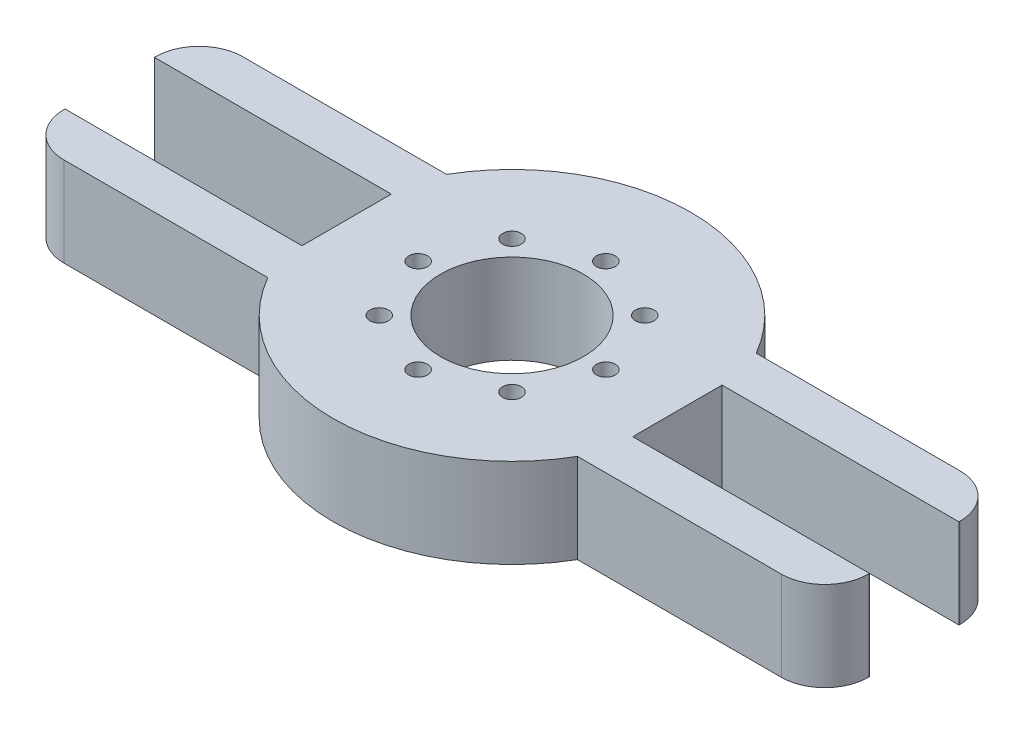
ISO-10303-21;
HEADER;
FILE_DESCRIPTION(('STEP AP214'),'2;1');
FILE_NAME('part.step','',(''),(''),'','','');
FILE_SCHEMA(('AUTOMOTIVE_DESIGN { 1 0 10303 214 1 1 1 1 }'));
ENDSEC;
DATA;
#1=APPLICATION_CONTEXT('core data for automotive mechanical design processes');
#2=APPLICATION_PROTOCOL_DEFINITION('international standard','automotive_design',2000,#1);
#3=PRODUCT_CONTEXT('',#1,'mechanical');
#4=PRODUCT('Part','Part','',(#3));
#5=PRODUCT_RELATED_PRODUCT_CATEGORY('part','',(#4));
#6=PRODUCT_DEFINITION_FORMATION('','',#4);
#7=PRODUCT_DEFINITION_CONTEXT('part definition',#1,'design');
#8=PRODUCT_DEFINITION('design','',#6,#7);
#9=PRODUCT_DEFINITION_SHAPE('','',#8);
#10=(LENGTH_UNIT() NAMED_UNIT(*) SI_UNIT(.MILLI.,.METRE.));
#11=(NAMED_UNIT(*) PLANE_ANGLE_UNIT() SI_UNIT($,.RADIAN.));
#12=(NAMED_UNIT(*) SI_UNIT($,.STERADIAN.) SOLID_ANGLE_UNIT());
#13=UNCERTAINTY_MEASURE_WITH_UNIT(LENGTH_MEASURE(1.E-05),#10,'distance_accuracy_value','');
#14=(GEOMETRIC_REPRESENTATION_CONTEXT(3) GLOBAL_UNCERTAINTY_ASSIGNED_CONTEXT((#13)) GLOBAL_UNIT_ASSIGNED_CONTEXT((#10,
#11,#12)) REPRESENTATION_CONTEXT('',''));
#15=CARTESIAN_POINT('',(0.,0.,0.));
#16=DIRECTION('',(0.,0.,1.));
#17=DIRECTION('',(1.,0.,0.));
#18=AXIS2_PLACEMENT_3D('',#15,#16,#17);
#19=CARTESIAN_POINT('',(-90.,20.,-20.));
#20=DIRECTION('',(-1.,0.,0.));
#21=DIRECTION('',(0.,0.,1.));
#22=AXIS2_PLACEMENT_3D('',#19,#20,#21);
#23=PLANE('',#22);
#24=DIRECTION('',(0.,0.,-1.));
#25=VECTOR('',#24,1.);
#26=CARTESIAN_POINT('',(-90.,20.,-20.));
#27=LINE('',#26,#25);
#28=CARTESIAN_POINT('',(-90.,20.,-10.));
#29=VERTEX_POINT('',#28);
#30=CARTESIAN_POINT('',(-90.,20.,-10.25));
#31=VERTEX_POINT('',#30);
#32=EDGE_CURVE('E209',#29,#31,#27,.T.);
#33=ORIENTED_EDGE('',*,*,#32,.T.);
#34=DIRECTION('',(0.,-1.,0.));
#35=VECTOR('',#34,1.);
#36=CARTESIAN_POINT('',(-90.,20.,-10.25));
#37=LINE('',#36,#35);
#38=CARTESIAN_POINT('',(-90.,0.,-10.25));
#39=VERTEX_POINT('',#38);
#40=EDGE_CURVE('E54',#31,#39,#37,.T.);
#41=ORIENTED_EDGE('',*,*,#40,.T.);
#42=DIRECTION('',(0.,0.,-1.));
#43=VECTOR('',#42,1.);
#44=CARTESIAN_POINT('',(-90.,0.,-20.));
#45=LINE('',#44,#43);
#46=CARTESIAN_POINT('',(-90.,0.,-10.));
#47=VERTEX_POINT('',#46);
#48=EDGE_CURVE('E242',#47,#39,#45,.T.);
#49=ORIENTED_EDGE('',*,*,#48,.F.);
#50=DIRECTION('',(0.,1.,0.));
#51=VECTOR('',#50,1.);
#52=CARTESIAN_POINT('',(-90.,-56.6480361530742,-10.));
#53=LINE('',#52,#51);
#54=EDGE_CURVE('E193',#47,#29,#53,.T.);
#55=ORIENTED_EDGE('',*,*,#54,.T.);
#56=EDGE_LOOP('',(#33,#41,#49,#55));
#57=FACE_BOUND('',#56,.T.);
#58=ADVANCED_FACE('F45',(#57),#23,.T.);
#59=CARTESIAN_POINT('',(-90.,0.,10.25));
#60=VERTEX_POINT('',#59);
#61=CARTESIAN_POINT('',(-90.,0.,10.));
#62=VERTEX_POINT('',#61);
#63=EDGE_CURVE('E244',#60,#62,#45,.T.);
#64=ORIENTED_EDGE('',*,*,#63,.F.);
#65=DIRECTION('',(0.,-1.,0.));
#66=VECTOR('',#65,1.);
#67=CARTESIAN_POINT('',(-90.,20.,10.25));
#68=LINE('',#67,#66);
#69=CARTESIAN_POINT('',(-90.,20.,10.25));
#70=VERTEX_POINT('',#69);
#71=EDGE_CURVE('E379',#60,#70,#68,.F.);
#72=ORIENTED_EDGE('',*,*,#71,.T.);
#73=CARTESIAN_POINT('',(-90.,20.,10.));
#74=VERTEX_POINT('',#73);
#75=EDGE_CURVE('E231',#70,#74,#27,.T.);
#76=ORIENTED_EDGE('',*,*,#75,.T.);
#77=DIRECTION('',(0.,1.,0.));
#78=VECTOR('',#77,1.);
#79=CARTESIAN_POINT('',(-90.,-56.6480361530742,10.));
#80=LINE('',#79,#78);
#81=EDGE_CURVE('E218',#62,#74,#80,.T.);
#82=ORIENTED_EDGE('',*,*,#81,.F.);
#83=EDGE_LOOP('',(#64,#72,#76,#82));
#84=FACE_BOUND('',#83,.T.);
#85=ADVANCED_FACE('F503',(#84),#23,.T.);
#86=CARTESIAN_POINT('',(90.,20.,-20.));
#87=DIRECTION('',(-1.,0.,0.));
#88=DIRECTION('',(0.,0.,1.));
#89=AXIS2_PLACEMENT_3D('',#86,#87,#88);
#90=PLANE('',#89);
#91=DIRECTION('',(0.,0.,-1.));
#92=VECTOR('',#91,1.);
#93=CARTESIAN_POINT('',(90.,0.,-20.));
#94=LINE('',#93,#92);
#95=CARTESIAN_POINT('',(90.,0.,-10.));
#96=VERTEX_POINT('',#95);
#97=CARTESIAN_POINT('',(90.,0.,-10.25));
#98=VERTEX_POINT('',#97);
#99=EDGE_CURVE('E330',#96,#98,#94,.T.);
#100=ORIENTED_EDGE('',*,*,#99,.T.);
#101=DIRECTION('',(0.,-1.,0.));
#102=VECTOR('',#101,1.);
#103=CARTESIAN_POINT('',(90.,20.,-10.25));
#104=LINE('',#103,#102);
#105=CARTESIAN_POINT('',(90.,20.,-10.25));
#106=VERTEX_POINT('',#105);
#107=EDGE_CURVE('E366',#98,#106,#104,.F.);
#108=ORIENTED_EDGE('',*,*,#107,.T.);
#109=DIRECTION('',(0.,0.,-1.));
#110=VECTOR('',#109,1.);
#111=CARTESIAN_POINT('',(90.,20.,-20.));
#112=LINE('',#111,#110);
#113=CARTESIAN_POINT('',(90.,20.,-10.));
#114=VERTEX_POINT('',#113);
#115=EDGE_CURVE('E312',#114,#106,#112,.T.);
#116=ORIENTED_EDGE('',*,*,#115,.F.);
#117=DIRECTION('',(0.,1.,0.));
#118=VECTOR('',#117,1.);
#119=CARTESIAN_POINT('',(90.,-56.6480361530742,-10.));
#120=LINE('',#119,#118);
#121=EDGE_CURVE('E282',#96,#114,#120,.T.);
#122=ORIENTED_EDGE('',*,*,#121,.F.);
#123=EDGE_LOOP('',(#100,#108,#116,#122));
#124=FACE_BOUND('',#123,.T.);
#125=ADVANCED_FACE('F509',(#124),#90,.F.);
#126=CARTESIAN_POINT('',(0.,20.,0.));
#127=DIRECTION('',(0.,-1.,0.));
#128=DIRECTION('',(0.,0.,-1.));
#129=AXIS2_PLACEMENT_3D('',#126,#127,#128);
#130=CYLINDRICAL_SURFACE('',#129,40.);
#131=CARTESIAN_POINT('',(0.,0.,0.));
#132=DIRECTION('',(0.,1.,0.));
#133=DIRECTION('',(0.,0.,1.));
#134=AXIS2_PLACEMENT_3D('',#131,#132,#133);
#135=CIRCLE('',#134,40.);
#136=CARTESIAN_POINT('',(34.6410161513776,0.,-20.));
#137=VERTEX_POINT('',#136);
#138=CARTESIAN_POINT('',(-34.6410161513776,0.,-20.));
#139=VERTEX_POINT('',#138);
#140=EDGE_CURVE('E293',#137,#139,#135,.T.);
#141=ORIENTED_EDGE('',*,*,#140,.T.);
#142=DIRECTION('',(0.,-1.,0.));
#143=VECTOR('',#142,1.);
#144=CARTESIAN_POINT('',(-34.6410161513776,20.,-20.));
#145=LINE('',#144,#143);
#146=CARTESIAN_POINT('',(-34.6410161513776,20.,-20.));
#147=VERTEX_POINT('',#146);
#148=EDGE_CURVE('E253',#147,#139,#145,.T.);
#149=ORIENTED_EDGE('',*,*,#148,.F.);
#150=CARTESIAN_POINT('',(0.,20.,0.));
#151=DIRECTION('',(0.,1.,0.));
#152=DIRECTION('',(0.,0.,1.));
#153=AXIS2_PLACEMENT_3D('',#150,#151,#152);
#154=CIRCLE('',#153,40.);
#155=CARTESIAN_POINT('',(34.6410161513776,20.,-20.));
#156=VERTEX_POINT('',#155);
#157=EDGE_CURVE('E300',#156,#147,#154,.T.);
#158=ORIENTED_EDGE('',*,*,#157,.F.);
#159=DIRECTION('',(0.,-1.,0.));
#160=VECTOR('',#159,1.);
#161=CARTESIAN_POINT('',(34.6410161513776,20.,-20.));
#162=LINE('',#161,#160);
#163=EDGE_CURVE('E319',#156,#137,#162,.T.);
#164=ORIENTED_EDGE('',*,*,#163,.T.);
#165=EDGE_LOOP('',(#141,#149,#158,#164));
#166=FACE_BOUND('',#165,.T.);
#167=ADVANCED_FACE('F552',(#166),#130,.T.);
#168=CARTESIAN_POINT('',(0.,20.,0.));
#169=DIRECTION('',(0.,-1.,0.));
#170=DIRECTION('',(0.,0.,-1.));
#171=AXIS2_PLACEMENT_3D('',#168,#169,#170);
#172=CYLINDRICAL_SURFACE('',#171,40.);
#173=CARTESIAN_POINT('',(0.,0.,0.));
#174=DIRECTION('',(0.,1.,0.));
#175=DIRECTION('',(0.,0.,1.));
#176=AXIS2_PLACEMENT_3D('',#173,#174,#175);
#177=CIRCLE('',#176,40.);
#178=CARTESIAN_POINT('',(-34.6410161513775,0.,20.));
#179=VERTEX_POINT('',#178);
#180=CARTESIAN_POINT('',(34.6410161513775,0.,20.));
#181=VERTEX_POINT('',#180);
#182=EDGE_CURVE('E323',#179,#181,#177,.T.);
#183=ORIENTED_EDGE('',*,*,#182,.T.);
#184=DIRECTION('',(0.,-1.,0.));
#185=VECTOR('',#184,1.);
#186=CARTESIAN_POINT('',(34.6410161513775,20.,20.));
#187=LINE('',#186,#185);
#188=CARTESIAN_POINT('',(34.6410161513775,20.,20.));
#189=VERTEX_POINT('',#188);
#190=EDGE_CURVE('E339',#189,#181,#187,.T.);
#191=ORIENTED_EDGE('',*,*,#190,.F.);
#192=CARTESIAN_POINT('',(0.,20.,0.));
#193=DIRECTION('',(0.,1.,0.));
#194=DIRECTION('',(0.,0.,1.));
#195=AXIS2_PLACEMENT_3D('',#192,#193,#194);
#196=CIRCLE('',#195,40.);
#197=CARTESIAN_POINT('',(-34.6410161513775,20.,20.));
#198=VERTEX_POINT('',#197);
#199=EDGE_CURVE('E304',#198,#189,#196,.T.);
#200=ORIENTED_EDGE('',*,*,#199,.F.);
#201=DIRECTION('',(0.,-1.,0.));
#202=VECTOR('',#201,1.);
#203=CARTESIAN_POINT('',(-34.6410161513775,20.,20.));
#204=LINE('',#203,#202);
#205=EDGE_CURVE('E238',#198,#179,#204,.T.);
#206=ORIENTED_EDGE('',*,*,#205,.T.);
#207=EDGE_LOOP('',(#183,#191,#200,#206));
#208=FACE_BOUND('',#207,.T.);
#209=ADVANCED_FACE('F548',(#208),#172,.T.);
#210=CARTESIAN_POINT('',(90.,20.,20.));
#211=DIRECTION('',(0.,0.,-1.));
#212=DIRECTION('',(-1.,0.,0.));
#213=AXIS2_PLACEMENT_3D('',#210,#211,#212);
#214=PLANE('',#213);
#215=DIRECTION('',(1.,0.,0.));
#216=VECTOR('',#215,1.);
#217=CARTESIAN_POINT('',(90.,0.,20.));
#218=LINE('',#217,#216);
#219=CARTESIAN_POINT('',(80.25,0.,20.));
#220=VERTEX_POINT('',#219);
#221=EDGE_CURVE('E326',#181,#220,#218,.T.);
#222=ORIENTED_EDGE('',*,*,#221,.T.);
#223=DIRECTION('',(0.,-1.,0.));
#224=VECTOR('',#223,1.);
#225=CARTESIAN_POINT('',(80.25,20.,20.));
#226=LINE('',#225,#224);
#227=CARTESIAN_POINT('',(80.25,20.,20.));
#228=VERTEX_POINT('',#227);
#229=EDGE_CURVE('E353',#220,#228,#226,.F.);
#230=ORIENTED_EDGE('',*,*,#229,.T.);
#231=DIRECTION('',(1.,0.,0.));
#232=VECTOR('',#231,1.);
#233=CARTESIAN_POINT('',(90.,20.,20.));
#234=LINE('',#233,#232);
#235=EDGE_CURVE('E308',#189,#228,#234,.T.);
#236=ORIENTED_EDGE('',*,*,#235,.F.);
#237=ORIENTED_EDGE('',*,*,#190,.T.);
#238=EDGE_LOOP('',(#222,#230,#236,#237));
#239=FACE_BOUND('',#238,.T.);
#240=ADVANCED_FACE('F544',(#239),#214,.F.);
#241=CARTESIAN_POINT('',(90.,20.,10.25));
#242=VERTEX_POINT('',#241);
#243=CARTESIAN_POINT('',(90.,20.,10.));
#244=VERTEX_POINT('',#243);
#245=EDGE_CURVE('E313',#242,#244,#112,.T.);
#246=ORIENTED_EDGE('',*,*,#245,.F.);
#247=DIRECTION('',(0.,-1.,0.));
#248=VECTOR('',#247,1.);
#249=CARTESIAN_POINT('',(90.,20.,10.25));
#250=LINE('',#249,#248);
#251=CARTESIAN_POINT('',(90.,0.,10.25));
#252=VERTEX_POINT('',#251);
#253=EDGE_CURVE('E343',#242,#252,#250,.T.);
#254=ORIENTED_EDGE('',*,*,#253,.T.);
#255=CARTESIAN_POINT('',(90.,0.,10.));
#256=VERTEX_POINT('',#255);
#257=EDGE_CURVE('E331',#252,#256,#94,.T.);
#258=ORIENTED_EDGE('',*,*,#257,.T.);
#259=DIRECTION('',(0.,1.,0.));
#260=VECTOR('',#259,1.);
#261=CARTESIAN_POINT('',(90.,-56.6480361530742,10.));
#262=LINE('',#261,#260);
#263=EDGE_CURVE('E285',#256,#244,#262,.T.);
#264=ORIENTED_EDGE('',*,*,#263,.T.);
#265=EDGE_LOOP('',(#246,#254,#258,#264));
#266=FACE_BOUND('',#265,.T.);
#267=ADVANCED_FACE('F540',(#266),#90,.F.);
#268=CARTESIAN_POINT('',(34.6410161513776,20.,-20.));
#269=DIRECTION('',(0.,0.,1.));
#270=DIRECTION('',(1.,0.,0.));
#271=AXIS2_PLACEMENT_3D('',#268,#269,#270);
#272=PLANE('',#271);
#273=DIRECTION('',(-1.,0.,0.));
#274=VECTOR('',#273,1.);
#275=CARTESIAN_POINT('',(34.6410161513776,20.,-20.));
#276=LINE('',#275,#274);
#277=CARTESIAN_POINT('',(80.25,20.,-20.));
#278=VERTEX_POINT('',#277);
#279=EDGE_CURVE('E316',#278,#156,#276,.T.);
#280=ORIENTED_EDGE('',*,*,#279,.F.);
#281=DIRECTION('',(0.,-1.,0.));
#282=VECTOR('',#281,1.);
#283=CARTESIAN_POINT('',(80.25,20.,-20.));
#284=LINE('',#283,#282);
#285=CARTESIAN_POINT('',(80.25,0.,-20.));
#286=VERTEX_POINT('',#285);
#287=EDGE_CURVE('E362',#278,#286,#284,.T.);
#288=ORIENTED_EDGE('',*,*,#287,.T.);
#289=DIRECTION('',(-1.,0.,0.));
#290=VECTOR('',#289,1.);
#291=CARTESIAN_POINT('',(34.6410161513776,0.,-20.));
#292=LINE('',#291,#290);
#293=EDGE_CURVE('E305',#286,#137,#292,.T.);
#294=ORIENTED_EDGE('',*,*,#293,.T.);
#295=ORIENTED_EDGE('',*,*,#163,.F.);
#296=EDGE_LOOP('',(#280,#288,#294,#295));
#297=FACE_BOUND('',#296,.T.);
#298=ADVANCED_FACE('F471',(#297),#272,.F.);
#299=CARTESIAN_POINT('',(0.,20.,0.));
#300=DIRECTION('',(0.,1.,0.));
#301=DIRECTION('',(0.,0.,1.));
#302=AXIS2_PLACEMENT_3D('',#299,#300,#301);
#303=PLANE('',#302);
#304=CARTESIAN_POINT('',(21.,20.,0.));
#305=DIRECTION('',(0.,1.,0.));
#306=DIRECTION('',(0.,0.,1.));
#307=AXIS2_PLACEMENT_3D('',#304,#305,#306);
#308=CIRCLE('',#307,2.1);
#309=CARTESIAN_POINT('',(21.,20.,2.1));
#310=VERTEX_POINT('',#309);
#311=EDGE_CURVE('E456',#310,#310,#308,.T.);
#312=ORIENTED_EDGE('',*,*,#311,.F.);
#313=EDGE_LOOP('',(#312));
#314=FACE_BOUND('',#313,.T.);
#315=CARTESIAN_POINT('',(14.8492424049175,20.,14.8492424049175));
#316=DIRECTION('',(0.,1.,0.));
#317=DIRECTION('',(0.,0.,1.));
#318=AXIS2_PLACEMENT_3D('',#315,#316,#317);
#319=CIRCLE('',#318,2.1);
#320=CARTESIAN_POINT('',(14.8492424049175,20.,16.9492424049175));
#321=VERTEX_POINT('',#320);
#322=EDGE_CURVE('E452',#321,#321,#319,.T.);
#323=ORIENTED_EDGE('',*,*,#322,.F.);
#324=EDGE_LOOP('',(#323));
#325=FACE_BOUND('',#324,.T.);
#326=CARTESIAN_POINT('',(0.,20.,21.));
#327=DIRECTION('',(0.,1.,0.));
#328=DIRECTION('',(0.,0.,1.));
#329=AXIS2_PLACEMENT_3D('',#326,#327,#328);
#330=CIRCLE('',#329,2.1);
#331=CARTESIAN_POINT('',(0.,20.,23.1));
#332=VERTEX_POINT('',#331);
#333=EDGE_CURVE('E444',#332,#332,#330,.T.);
#334=ORIENTED_EDGE('',*,*,#333,.F.);
#335=EDGE_LOOP('',(#334));
#336=FACE_BOUND('',#335,.T.);
#337=CARTESIAN_POINT('',(-14.8492424049176,20.,14.8492424049174));
#338=DIRECTION('',(0.,1.,0.));
#339=DIRECTION('',(0.,0.,1.));
#340=AXIS2_PLACEMENT_3D('',#337,#338,#339);
#341=CIRCLE('',#340,2.1);
#342=CARTESIAN_POINT('',(-14.8492424049176,20.,16.9492424049174));
#343=VERTEX_POINT('',#342);
#344=EDGE_CURVE('E436',#343,#343,#341,.T.);
#345=ORIENTED_EDGE('',*,*,#344,.F.);
#346=EDGE_LOOP('',(#345));
#347=FACE_BOUND('',#346,.T.);
#348=CARTESIAN_POINT('',(-21.,20.,-1.46642216231412E-13));
#349=DIRECTION('',(0.,1.,0.));
#350=DIRECTION('',(0.,0.,1.));
#351=AXIS2_PLACEMENT_3D('',#348,#349,#350);
#352=CIRCLE('',#351,2.1);
#353=CARTESIAN_POINT('',(-21.,20.,2.09999999999985));
#354=VERTEX_POINT('',#353);
#355=EDGE_CURVE('E428',#354,#354,#352,.T.);
#356=ORIENTED_EDGE('',*,*,#355,.F.);
#357=EDGE_LOOP('',(#356));
#358=FACE_BOUND('',#357,.T.);
#359=CARTESIAN_POINT('',(-14.8492424049174,20.,-14.8492424049176));
#360=DIRECTION('',(0.,1.,0.));
#361=DIRECTION('',(0.,0.,1.));
#362=AXIS2_PLACEMENT_3D('',#359,#360,#361);
#363=CIRCLE('',#362,2.1);
#364=CARTESIAN_POINT('',(-14.8492424049174,20.,-12.7492424049176));
#365=VERTEX_POINT('',#364);
#366=EDGE_CURVE('E420',#365,#365,#363,.T.);
#367=ORIENTED_EDGE('',*,*,#366,.F.);
#368=EDGE_LOOP('',(#367));
#369=FACE_BOUND('',#368,.T.);
#370=CARTESIAN_POINT('',(2.19963324347117E-13,20.,-21.));
#371=DIRECTION('',(0.,1.,0.));
#372=DIRECTION('',(0.,0.,1.));
#373=AXIS2_PLACEMENT_3D('',#370,#371,#372);
#374=CIRCLE('',#373,2.1);
#375=CARTESIAN_POINT('',(2.19963324347117E-13,20.,-18.9));
#376=VERTEX_POINT('',#375);
#377=EDGE_CURVE('E412',#376,#376,#374,.T.);
#378=ORIENTED_EDGE('',*,*,#377,.F.);
#379=EDGE_LOOP('',(#378));
#380=FACE_BOUND('',#379,.T.);
#381=CARTESIAN_POINT('',(14.8492424049177,20.,-14.8492424049173));
#382=DIRECTION('',(0.,1.,0.));
#383=DIRECTION('',(0.,0.,1.));
#384=AXIS2_PLACEMENT_3D('',#381,#382,#383);
#385=CIRCLE('',#384,2.1);
#386=CARTESIAN_POINT('',(14.8492424049177,20.,-12.7492424049173));
#387=VERTEX_POINT('',#386);
#388=EDGE_CURVE('E403',#387,#387,#385,.T.);
#389=ORIENTED_EDGE('',*,*,#388,.F.);
#390=EDGE_LOOP('',(#389));
#391=FACE_BOUND('',#390,.T.);
#392=ORIENTED_EDGE('',*,*,#75,.F.);
#393=CARTESIAN_POINT('',(-80.25,20.,10.25));
#394=DIRECTION('',(0.,1.,0.));
#395=DIRECTION('',(0.,0.,1.));
#396=AXIS2_PLACEMENT_3D('',#393,#394,#395);
#397=CIRCLE('',#396,9.75);
#398=CARTESIAN_POINT('',(-80.25,20.,20.));
#399=VERTEX_POINT('',#398);
#400=EDGE_CURVE('E384',#70,#399,#397,.T.);
#401=ORIENTED_EDGE('',*,*,#400,.T.);
#402=DIRECTION('',(-1.,0.,0.));
#403=VECTOR('',#402,1.);
#404=CARTESIAN_POINT('',(-90.,20.,20.));
#405=LINE('',#404,#403);
#406=EDGE_CURVE('E234',#198,#399,#405,.T.);
#407=ORIENTED_EDGE('',*,*,#406,.F.);
#408=ORIENTED_EDGE('',*,*,#199,.T.);
#409=ORIENTED_EDGE('',*,*,#235,.T.);
#410=CARTESIAN_POINT('',(80.25,20.,10.25));
#411=DIRECTION('',(0.,1.,0.));
#412=DIRECTION('',(0.,0.,1.));
#413=AXIS2_PLACEMENT_3D('',#410,#411,#412);
#414=CIRCLE('',#413,9.75);
#415=EDGE_CURVE('E359',#228,#242,#414,.T.);
#416=ORIENTED_EDGE('',*,*,#415,.T.);
#417=ORIENTED_EDGE('',*,*,#245,.T.);
#418=DIRECTION('',(1.,0.,0.));
#419=VECTOR('',#418,1.);
#420=CARTESIAN_POINT('',(90.,20.,10.));
#421=LINE('',#420,#419);
#422=CARTESIAN_POINT('',(37.,20.,10.));
#423=VERTEX_POINT('',#422);
#424=EDGE_CURVE('E270',#423,#244,#421,.T.);
#425=ORIENTED_EDGE('',*,*,#424,.F.);
#426=DIRECTION('',(0.,0.,1.));
#427=VECTOR('',#426,1.);
#428=CARTESIAN_POINT('',(37.,20.,10.));
#429=LINE('',#428,#427);
#430=CARTESIAN_POINT('',(37.,20.,-10.));
#431=VERTEX_POINT('',#430);
#432=EDGE_CURVE('E266',#431,#423,#429,.T.);
#433=ORIENTED_EDGE('',*,*,#432,.F.);
#434=DIRECTION('',(-1.,0.,0.));
#435=VECTOR('',#434,1.);
#436=CARTESIAN_POINT('',(37.,20.,-10.));
#437=LINE('',#436,#435);
#438=EDGE_CURVE('E275',#114,#431,#437,.T.);
#439=ORIENTED_EDGE('',*,*,#438,.F.);
#440=ORIENTED_EDGE('',*,*,#115,.T.);
#441=CARTESIAN_POINT('',(80.25,20.,-10.25));
#442=DIRECTION('',(0.,1.,0.));
#443=DIRECTION('',(0.,0.,1.));
#444=AXIS2_PLACEMENT_3D('',#441,#442,#443);
#445=CIRCLE('',#444,9.75);
#446=EDGE_CURVE('E356',#106,#278,#445,.T.);
#447=ORIENTED_EDGE('',*,*,#446,.T.);
#448=ORIENTED_EDGE('',*,*,#279,.T.);
#449=ORIENTED_EDGE('',*,*,#157,.T.);
#450=DIRECTION('',(1.,0.,0.));
#451=VECTOR('',#450,1.);
#452=CARTESIAN_POINT('',(-34.6410161513776,20.,-20.));
#453=LINE('',#452,#451);
#454=CARTESIAN_POINT('',(-80.25,20.,-20.));
#455=VERTEX_POINT('',#454);
#456=EDGE_CURVE('E227',#455,#147,#453,.T.);
#457=ORIENTED_EDGE('',*,*,#456,.F.);
#458=CARTESIAN_POINT('',(-80.25,20.,-10.25));
#459=DIRECTION('',(0.,1.,0.));
#460=DIRECTION('',(0.,0.,1.));
#461=AXIS2_PLACEMENT_3D('',#458,#459,#460);
#462=CIRCLE('',#461,9.75);
#463=EDGE_CURVE('E66',#455,#31,#462,.T.);
#464=ORIENTED_EDGE('',*,*,#463,.T.);
#465=ORIENTED_EDGE('',*,*,#32,.F.);
#466=DIRECTION('',(1.,0.,0.));
#467=VECTOR('',#466,1.);
#468=CARTESIAN_POINT('',(-37.,20.,-10.));
#469=LINE('',#468,#467);
#470=CARTESIAN_POINT('',(-37.,20.,-10.));
#471=VERTEX_POINT('',#470);
#472=EDGE_CURVE('E186',#29,#471,#469,.T.);
#473=ORIENTED_EDGE('',*,*,#472,.T.);
#474=DIRECTION('',(0.,0.,1.));
#475=VECTOR('',#474,1.);
#476=CARTESIAN_POINT('',(-37.,20.,10.));
#477=LINE('',#476,#475);
#478=CARTESIAN_POINT('',(-37.,20.,10.));
#479=VERTEX_POINT('',#478);
#480=EDGE_CURVE('E197',#471,#479,#477,.T.);
#481=ORIENTED_EDGE('',*,*,#480,.T.);
#482=DIRECTION('',(-1.,0.,0.));
#483=VECTOR('',#482,1.);
#484=CARTESIAN_POINT('',(-90.,20.,10.));
#485=LINE('',#484,#483);
#486=EDGE_CURVE('E194',#479,#74,#485,.T.);
#487=ORIENTED_EDGE('',*,*,#486,.T.);
#488=EDGE_LOOP('',(#392,#401,#407,#408,#409,#416,#417,#425,#433,#439,#440,#447,#448,#449,#457,
#464,#465,#473,#481,#487));
#489=FACE_BOUND('',#488,.T.);
#490=CARTESIAN_POINT('',(0.,20.,0.));
#491=DIRECTION('',(0.,1.,0.));
#492=DIRECTION('',(0.,0.,1.));
#493=AXIS2_PLACEMENT_3D('',#490,#491,#492);
#494=CIRCLE('',#493,16.);
#495=CARTESIAN_POINT('',(0.,20.,16.));
#496=VERTEX_POINT('',#495);
#497=EDGE_CURVE('E271',#496,#496,#494,.T.);
#498=ORIENTED_EDGE('',*,*,#497,.F.);
#499=EDGE_LOOP('',(#498));
#500=FACE_BOUND('',#499,.T.);
#501=ADVANCED_FACE('F207',(#314,#325,#336,#347,#358,#369,#380,#391,#489,#500),#303,.T.);
#502=CARTESIAN_POINT('',(0.,0.,0.));
#503=DIRECTION('',(0.,1.,0.));
#504=DIRECTION('',(0.,0.,1.));
#505=AXIS2_PLACEMENT_3D('',#502,#503,#504);
#506=PLANE('',#505);
#507=CARTESIAN_POINT('',(21.,0.,0.));
#508=DIRECTION('',(0.,1.,0.));
#509=DIRECTION('',(0.,0.,1.));
#510=AXIS2_PLACEMENT_3D('',#507,#508,#509);
#511=CIRCLE('',#510,2.1);
#512=CARTESIAN_POINT('',(21.,0.,2.1));
#513=VERTEX_POINT('',#512);
#514=EDGE_CURVE('E204',#513,#513,#511,.F.);
#515=ORIENTED_EDGE('',*,*,#514,.F.);
#516=EDGE_LOOP('',(#515));
#517=FACE_BOUND('',#516,.T.);
#518=CARTESIAN_POINT('',(14.8492424049175,0.,14.8492424049175));
#519=DIRECTION('',(0.,1.,0.));
#520=DIRECTION('',(0.,0.,1.));
#521=AXIS2_PLACEMENT_3D('',#518,#519,#520);
#522=CIRCLE('',#521,2.1);
#523=CARTESIAN_POINT('',(14.8492424049175,0.,16.9492424049175));
#524=VERTEX_POINT('',#523);
#525=EDGE_CURVE('E448',#524,#524,#522,.F.);
#526=ORIENTED_EDGE('',*,*,#525,.F.);
#527=EDGE_LOOP('',(#526));
#528=FACE_BOUND('',#527,.T.);
#529=CARTESIAN_POINT('',(0.,0.,21.));
#530=DIRECTION('',(0.,1.,0.));
#531=DIRECTION('',(0.,0.,1.));
#532=AXIS2_PLACEMENT_3D('',#529,#530,#531);
#533=CIRCLE('',#532,2.1);
#534=CARTESIAN_POINT('',(0.,0.,23.1));
#535=VERTEX_POINT('',#534);
#536=EDGE_CURVE('E440',#535,#535,#533,.F.);
#537=ORIENTED_EDGE('',*,*,#536,.F.);
#538=EDGE_LOOP('',(#537));
#539=FACE_BOUND('',#538,.T.);
#540=CARTESIAN_POINT('',(-14.8492424049176,0.,14.8492424049174));
#541=DIRECTION('',(0.,1.,0.));
#542=DIRECTION('',(0.,0.,1.));
#543=AXIS2_PLACEMENT_3D('',#540,#541,#542);
#544=CIRCLE('',#543,2.1);
#545=CARTESIAN_POINT('',(-14.8492424049176,0.,16.9492424049174));
#546=VERTEX_POINT('',#545);
#547=EDGE_CURVE('E432',#546,#546,#544,.F.);
#548=ORIENTED_EDGE('',*,*,#547,.F.);
#549=EDGE_LOOP('',(#548));
#550=FACE_BOUND('',#549,.T.);
#551=CARTESIAN_POINT('',(-21.,0.,-1.46642216231412E-13));
#552=DIRECTION('',(0.,1.,0.));
#553=DIRECTION('',(0.,0.,1.));
#554=AXIS2_PLACEMENT_3D('',#551,#552,#553);
#555=CIRCLE('',#554,2.1);
#556=CARTESIAN_POINT('',(-21.,0.,2.09999999999985));
#557=VERTEX_POINT('',#556);
#558=EDGE_CURVE('E424',#557,#557,#555,.F.);
#559=ORIENTED_EDGE('',*,*,#558,.F.);
#560=EDGE_LOOP('',(#559));
#561=FACE_BOUND('',#560,.T.);
#562=CARTESIAN_POINT('',(-14.8492424049174,0.,-14.8492424049176));
#563=DIRECTION('',(0.,1.,0.));
#564=DIRECTION('',(0.,0.,1.));
#565=AXIS2_PLACEMENT_3D('',#562,#563,#564);
#566=CIRCLE('',#565,2.1);
#567=CARTESIAN_POINT('',(-14.8492424049174,0.,-12.7492424049176));
#568=VERTEX_POINT('',#567);
#569=EDGE_CURVE('E416',#568,#568,#566,.F.);
#570=ORIENTED_EDGE('',*,*,#569,.F.);
#571=EDGE_LOOP('',(#570));
#572=FACE_BOUND('',#571,.T.);
#573=CARTESIAN_POINT('',(2.19963324347117E-13,0.,-21.));
#574=DIRECTION('',(0.,1.,0.));
#575=DIRECTION('',(0.,0.,1.));
#576=AXIS2_PLACEMENT_3D('',#573,#574,#575);
#577=CIRCLE('',#576,2.1);
#578=CARTESIAN_POINT('',(2.19963324347117E-13,0.,-18.9));
#579=VERTEX_POINT('',#578);
#580=EDGE_CURVE('E407',#579,#579,#577,.F.);
#581=ORIENTED_EDGE('',*,*,#580,.F.);
#582=EDGE_LOOP('',(#581));
#583=FACE_BOUND('',#582,.T.);
#584=CARTESIAN_POINT('',(14.8492424049177,0.,-14.8492424049173));
#585=DIRECTION('',(0.,1.,0.));
#586=DIRECTION('',(0.,0.,1.));
#587=AXIS2_PLACEMENT_3D('',#584,#585,#586);
#588=CIRCLE('',#587,2.1);
#589=CARTESIAN_POINT('',(14.8492424049177,0.,-12.7492424049173));
#590=VERTEX_POINT('',#589);
#591=EDGE_CURVE('E408',#590,#590,#588,.F.);
#592=ORIENTED_EDGE('',*,*,#591,.F.);
#593=EDGE_LOOP('',(#592));
#594=FACE_BOUND('',#593,.T.);
#595=DIRECTION('',(-1.,0.,0.));
#596=VECTOR('',#595,1.);
#597=CARTESIAN_POINT('',(-90.,0.,20.));
#598=LINE('',#597,#596);
#599=CARTESIAN_POINT('',(-80.25,0.,20.));
#600=VERTEX_POINT('',#599);
#601=EDGE_CURVE('E230',#179,#600,#598,.T.);
#602=ORIENTED_EDGE('',*,*,#601,.T.);
#603=CARTESIAN_POINT('',(-80.25,0.,10.25));
#604=DIRECTION('',(0.,1.,0.));
#605=DIRECTION('',(0.,0.,1.));
#606=AXIS2_PLACEMENT_3D('',#603,#604,#605);
#607=CIRCLE('',#606,9.75);
#608=EDGE_CURVE('E376',#600,#60,#607,.F.);
#609=ORIENTED_EDGE('',*,*,#608,.T.);
#610=ORIENTED_EDGE('',*,*,#63,.T.);
#611=DIRECTION('',(1.,0.,0.));
#612=VECTOR('',#611,1.);
#613=CARTESIAN_POINT('',(-90.,0.,10.));
#614=LINE('',#613,#612);
#615=CARTESIAN_POINT('',(-37.,0.,10.));
#616=VERTEX_POINT('',#615);
#617=EDGE_CURVE('E226',#62,#616,#614,.T.);
#618=ORIENTED_EDGE('',*,*,#617,.T.);
#619=DIRECTION('',(0.,0.,-1.));
#620=VECTOR('',#619,1.);
#621=CARTESIAN_POINT('',(-37.,0.,10.));
#622=LINE('',#621,#620);
#623=CARTESIAN_POINT('',(-37.,0.,-10.));
#624=VERTEX_POINT('',#623);
#625=EDGE_CURVE('E243',#616,#624,#622,.T.);
#626=ORIENTED_EDGE('',*,*,#625,.T.);
#627=DIRECTION('',(-1.,0.,0.));
#628=VECTOR('',#627,1.);
#629=CARTESIAN_POINT('',(-37.,0.,-10.));
#630=LINE('',#629,#628);
#631=EDGE_CURVE('E189',#624,#47,#630,.T.);
#632=ORIENTED_EDGE('',*,*,#631,.T.);
#633=ORIENTED_EDGE('',*,*,#48,.T.);
#634=CARTESIAN_POINT('',(-80.25,0.,-10.25));
#635=DIRECTION('',(0.,1.,0.));
#636=DIRECTION('',(0.,0.,1.));
#637=AXIS2_PLACEMENT_3D('',#634,#635,#636);
#638=CIRCLE('',#637,9.75);
#639=CARTESIAN_POINT('',(-80.25,0.,-20.));
#640=VERTEX_POINT('',#639);
#641=EDGE_CURVE('E373',#39,#640,#638,.F.);
#642=ORIENTED_EDGE('',*,*,#641,.T.);
#643=DIRECTION('',(1.,0.,0.));
#644=VECTOR('',#643,1.);
#645=CARTESIAN_POINT('',(-34.6410161513776,0.,-20.));
#646=LINE('',#645,#644);
#647=EDGE_CURVE('E239',#640,#139,#646,.T.);
#648=ORIENTED_EDGE('',*,*,#647,.T.);
#649=ORIENTED_EDGE('',*,*,#140,.F.);
#650=ORIENTED_EDGE('',*,*,#293,.F.);
#651=CARTESIAN_POINT('',(80.25,0.,-10.25));
#652=DIRECTION('',(0.,1.,0.));
#653=DIRECTION('',(0.,0.,1.));
#654=AXIS2_PLACEMENT_3D('',#651,#652,#653);
#655=CIRCLE('',#654,9.75);
#656=EDGE_CURVE('E347',#286,#98,#655,.F.);
#657=ORIENTED_EDGE('',*,*,#656,.T.);
#658=ORIENTED_EDGE('',*,*,#99,.F.);
#659=DIRECTION('',(1.,0.,0.));
#660=VECTOR('',#659,1.);
#661=CARTESIAN_POINT('',(37.,0.,-10.));
#662=LINE('',#661,#660);
#663=CARTESIAN_POINT('',(37.,0.,-10.));
#664=VERTEX_POINT('',#663);
#665=EDGE_CURVE('E258',#664,#96,#662,.T.);
#666=ORIENTED_EDGE('',*,*,#665,.F.);
#667=DIRECTION('',(0.,0.,-1.));
#668=VECTOR('',#667,1.);
#669=CARTESIAN_POINT('',(37.,0.,10.));
#670=LINE('',#669,#668);
#671=CARTESIAN_POINT('',(37.,0.,10.));
#672=VERTEX_POINT('',#671);
#673=EDGE_CURVE('E261',#672,#664,#670,.T.);
#674=ORIENTED_EDGE('',*,*,#673,.F.);
#675=DIRECTION('',(-1.,0.,0.));
#676=VECTOR('',#675,1.);
#677=CARTESIAN_POINT('',(90.,0.,10.));
#678=LINE('',#677,#676);
#679=EDGE_CURVE('E265',#256,#672,#678,.T.);
#680=ORIENTED_EDGE('',*,*,#679,.F.);
#681=ORIENTED_EDGE('',*,*,#257,.F.);
#682=CARTESIAN_POINT('',(80.25,0.,10.25));
#683=DIRECTION('',(0.,1.,0.));
#684=DIRECTION('',(0.,0.,1.));
#685=AXIS2_PLACEMENT_3D('',#682,#683,#684);
#686=CIRCLE('',#685,9.75);
#687=EDGE_CURVE('E350',#252,#220,#686,.F.);
#688=ORIENTED_EDGE('',*,*,#687,.T.);
#689=ORIENTED_EDGE('',*,*,#221,.F.);
#690=ORIENTED_EDGE('',*,*,#182,.F.);
#691=EDGE_LOOP('',(#602,#609,#610,#618,#626,#632,#633,#642,#648,#649,#650,#657,#658,#666,#674,
#680,#681,#688,#689,#690));
#692=FACE_BOUND('',#691,.T.);
#693=CARTESIAN_POINT('',(0.,0.,0.));
#694=DIRECTION('',(0.,1.,0.));
#695=DIRECTION('',(0.,0.,1.));
#696=AXIS2_PLACEMENT_3D('',#693,#694,#695);
#697=CIRCLE('',#696,16.);
#698=CARTESIAN_POINT('',(0.,0.,16.));
#699=VERTEX_POINT('',#698);
#700=EDGE_CURVE('E257',#699,#699,#697,.F.);
#701=ORIENTED_EDGE('',*,*,#700,.F.);
#702=EDGE_LOOP('',(#701));
#703=FACE_BOUND('',#702,.T.);
#704=ADVANCED_FACE('F394',(#517,#528,#539,#550,#561,#572,#583,#594,#692,#703),#506,.F.);
#705=CARTESIAN_POINT('',(0.,-56.6480361530742,0.));
#706=DIRECTION('',(0.,1.,0.));
#707=DIRECTION('',(0.,0.,1.));
#708=AXIS2_PLACEMENT_3D('',#705,#706,#707);
#709=CYLINDRICAL_SURFACE('',#708,16.);
#710=ORIENTED_EDGE('',*,*,#497,.T.);
#711=EDGE_LOOP('',(#710));
#712=FACE_BOUND('',#711,.T.);
#713=ORIENTED_EDGE('',*,*,#700,.T.);
#714=EDGE_LOOP('',(#713));
#715=FACE_BOUND('',#714,.T.);
#716=ADVANCED_FACE('F531',(#712,#715),#709,.F.);
#717=CARTESIAN_POINT('',(37.,-56.6480361530742,10.));
#718=DIRECTION('',(-1.,0.,0.));
#719=DIRECTION('',(0.,0.,1.));
#720=AXIS2_PLACEMENT_3D('',#717,#718,#719);
#721=PLANE('',#720);
#722=ORIENTED_EDGE('',*,*,#673,.T.);
#723=DIRECTION('',(0.,1.,0.));
#724=VECTOR('',#723,1.);
#725=CARTESIAN_POINT('',(37.,-56.6480361530742,-10.));
#726=LINE('',#725,#724);
#727=EDGE_CURVE('E262',#664,#431,#726,.T.);
#728=ORIENTED_EDGE('',*,*,#727,.T.);
#729=ORIENTED_EDGE('',*,*,#432,.T.);
#730=DIRECTION('',(0.,1.,0.));
#731=VECTOR('',#730,1.);
#732=CARTESIAN_POINT('',(37.,-56.6480361530742,10.));
#733=LINE('',#732,#731);
#734=EDGE_CURVE('E279',#672,#423,#733,.T.);
#735=ORIENTED_EDGE('',*,*,#734,.F.);
#736=EDGE_LOOP('',(#722,#728,#729,#735));
#737=FACE_BOUND('',#736,.T.);
#738=ADVANCED_FACE('F523',(#737),#721,.F.);
#739=CARTESIAN_POINT('',(37.,-56.6480361530742,-10.));
#740=DIRECTION('',(0.,0.,-1.));
#741=DIRECTION('',(-1.,0.,0.));
#742=AXIS2_PLACEMENT_3D('',#739,#740,#741);
#743=PLANE('',#742);
#744=ORIENTED_EDGE('',*,*,#665,.T.);
#745=ORIENTED_EDGE('',*,*,#121,.T.);
#746=ORIENTED_EDGE('',*,*,#438,.T.);
#747=ORIENTED_EDGE('',*,*,#727,.F.);
#748=EDGE_LOOP('',(#744,#745,#746,#747));
#749=FACE_BOUND('',#748,.T.);
#750=ADVANCED_FACE('F519',(#749),#743,.F.);
#751=CARTESIAN_POINT('',(90.,-56.6480361530742,10.));
#752=DIRECTION('',(0.,0.,1.));
#753=DIRECTION('',(1.,0.,0.));
#754=AXIS2_PLACEMENT_3D('',#751,#752,#753);
#755=PLANE('',#754);
#756=ORIENTED_EDGE('',*,*,#679,.T.);
#757=ORIENTED_EDGE('',*,*,#734,.T.);
#758=ORIENTED_EDGE('',*,*,#424,.T.);
#759=ORIENTED_EDGE('',*,*,#263,.F.);
#760=EDGE_LOOP('',(#756,#757,#758,#759));
#761=FACE_BOUND('',#760,.T.);
#762=ADVANCED_FACE('F522',(#761),#755,.F.);
#763=CARTESIAN_POINT('',(80.25,20.,10.25));
#764=DIRECTION('',(0.,-1.,0.));
#765=DIRECTION('',(0.,0.,-1.));
#766=AXIS2_PLACEMENT_3D('',#763,#764,#765);
#767=CYLINDRICAL_SURFACE('',#766,9.75);
#768=ORIENTED_EDGE('',*,*,#415,.F.);
#769=ORIENTED_EDGE('',*,*,#229,.F.);
#770=ORIENTED_EDGE('',*,*,#687,.F.);
#771=ORIENTED_EDGE('',*,*,#253,.F.);
#772=EDGE_LOOP('',(#768,#769,#770,#771));
#773=FACE_BOUND('',#772,.T.);
#774=ADVANCED_FACE('F527',(#773),#767,.T.);
#775=CARTESIAN_POINT('',(80.25,20.,-10.25));
#776=DIRECTION('',(0.,-1.,0.));
#777=DIRECTION('',(0.,0.,-1.));
#778=AXIS2_PLACEMENT_3D('',#775,#776,#777);
#779=CYLINDRICAL_SURFACE('',#778,9.75);
#780=ORIENTED_EDGE('',*,*,#446,.F.);
#781=ORIENTED_EDGE('',*,*,#107,.F.);
#782=ORIENTED_EDGE('',*,*,#656,.F.);
#783=ORIENTED_EDGE('',*,*,#287,.F.);
#784=EDGE_LOOP('',(#780,#781,#782,#783));
#785=FACE_BOUND('',#784,.T.);
#786=ADVANCED_FACE('F518',(#785),#779,.T.);
#787=CARTESIAN_POINT('',(-34.6410161513776,20.,-20.));
#788=DIRECTION('',(0.,0.,-1.));
#789=DIRECTION('',(-1.,0.,0.));
#790=AXIS2_PLACEMENT_3D('',#787,#788,#789);
#791=PLANE('',#790);
#792=ORIENTED_EDGE('',*,*,#647,.F.);
#793=DIRECTION('',(0.,-1.,0.));
#794=VECTOR('',#793,1.);
#795=CARTESIAN_POINT('',(-80.25,20.,-20.));
#796=LINE('',#795,#794);
#797=EDGE_CURVE('E11',#640,#455,#796,.F.);
#798=ORIENTED_EDGE('',*,*,#797,.T.);
#799=ORIENTED_EDGE('',*,*,#456,.T.);
#800=ORIENTED_EDGE('',*,*,#148,.T.);
#801=EDGE_LOOP('',(#792,#798,#799,#800));
#802=FACE_BOUND('',#801,.T.);
#803=ADVANCED_FACE('F515',(#802),#791,.T.);
#804=CARTESIAN_POINT('',(-90.,20.,20.));
#805=DIRECTION('',(0.,0.,1.));
#806=DIRECTION('',(1.,0.,0.));
#807=AXIS2_PLACEMENT_3D('',#804,#805,#806);
#808=PLANE('',#807);
#809=ORIENTED_EDGE('',*,*,#406,.T.);
#810=DIRECTION('',(0.,-1.,0.));
#811=VECTOR('',#810,1.);
#812=CARTESIAN_POINT('',(-80.25,20.,20.));
#813=LINE('',#812,#811);
#814=EDGE_CURVE('E369',#399,#600,#813,.T.);
#815=ORIENTED_EDGE('',*,*,#814,.T.);
#816=ORIENTED_EDGE('',*,*,#601,.F.);
#817=ORIENTED_EDGE('',*,*,#205,.F.);
#818=EDGE_LOOP('',(#809,#815,#816,#817));
#819=FACE_BOUND('',#818,.T.);
#820=ADVANCED_FACE('F513',(#819),#808,.T.);
#821=CARTESIAN_POINT('',(-37.,-56.6480361530742,-10.));
#822=DIRECTION('',(0.,0.,1.));
#823=DIRECTION('',(1.,0.,0.));
#824=AXIS2_PLACEMENT_3D('',#821,#822,#823);
#825=PLANE('',#824);
#826=DIRECTION('',(0.,1.,0.));
#827=VECTOR('',#826,1.);
#828=CARTESIAN_POINT('',(-37.,-56.6480361530742,-10.));
#829=LINE('',#828,#827);
#830=EDGE_CURVE('E182',#624,#471,#829,.T.);
#831=ORIENTED_EDGE('',*,*,#830,.T.);
#832=ORIENTED_EDGE('',*,*,#472,.F.);
#833=ORIENTED_EDGE('',*,*,#54,.F.);
#834=ORIENTED_EDGE('',*,*,#631,.F.);
#835=EDGE_LOOP('',(#831,#832,#833,#834));
#836=FACE_BOUND('',#835,.T.);
#837=ADVANCED_FACE('F184',(#836),#825,.T.);
#838=CARTESIAN_POINT('',(-90.,-56.6480361530742,10.));
#839=DIRECTION('',(0.,0.,-1.));
#840=DIRECTION('',(-1.,0.,0.));
#841=AXIS2_PLACEMENT_3D('',#838,#839,#840);
#842=PLANE('',#841);
#843=ORIENTED_EDGE('',*,*,#81,.T.);
#844=ORIENTED_EDGE('',*,*,#486,.F.);
#845=DIRECTION('',(0.,1.,0.));
#846=VECTOR('',#845,1.);
#847=CARTESIAN_POINT('',(-37.,-56.6480361530742,10.));
#848=LINE('',#847,#846);
#849=EDGE_CURVE('E200',#616,#479,#848,.T.);
#850=ORIENTED_EDGE('',*,*,#849,.F.);
#851=ORIENTED_EDGE('',*,*,#617,.F.);
#852=EDGE_LOOP('',(#843,#844,#850,#851));
#853=FACE_BOUND('',#852,.T.);
#854=ADVANCED_FACE('F566',(#853),#842,.T.);
#855=CARTESIAN_POINT('',(-37.,-56.6480361530742,10.));
#856=DIRECTION('',(-1.,0.,0.));
#857=DIRECTION('',(0.,0.,1.));
#858=AXIS2_PLACEMENT_3D('',#855,#856,#857);
#859=PLANE('',#858);
#860=ORIENTED_EDGE('',*,*,#849,.T.);
#861=ORIENTED_EDGE('',*,*,#480,.F.);
#862=ORIENTED_EDGE('',*,*,#830,.F.);
#863=ORIENTED_EDGE('',*,*,#625,.F.);
#864=EDGE_LOOP('',(#860,#861,#862,#863));
#865=FACE_BOUND('',#864,.T.);
#866=ADVANCED_FACE('F198',(#865),#859,.T.);
#867=CARTESIAN_POINT('',(-80.25,20.,10.25));
#868=DIRECTION('',(0.,-1.,0.));
#869=DIRECTION('',(0.,0.,-1.));
#870=AXIS2_PLACEMENT_3D('',#867,#868,#869);
#871=CYLINDRICAL_SURFACE('',#870,9.75);
#872=ORIENTED_EDGE('',*,*,#400,.F.);
#873=ORIENTED_EDGE('',*,*,#71,.F.);
#874=ORIENTED_EDGE('',*,*,#608,.F.);
#875=ORIENTED_EDGE('',*,*,#814,.F.);
#876=EDGE_LOOP('',(#872,#873,#874,#875));
#877=FACE_BOUND('',#876,.T.);
#878=ADVANCED_FACE('F500',(#877),#871,.T.);
#879=CARTESIAN_POINT('',(-80.25,20.,-10.25));
#880=DIRECTION('',(0.,-1.,0.));
#881=DIRECTION('',(0.,0.,-1.));
#882=AXIS2_PLACEMENT_3D('',#879,#880,#881);
#883=CYLINDRICAL_SURFACE('',#882,9.75);
#884=ORIENTED_EDGE('',*,*,#463,.F.);
#885=ORIENTED_EDGE('',*,*,#797,.F.);
#886=ORIENTED_EDGE('',*,*,#641,.F.);
#887=ORIENTED_EDGE('',*,*,#40,.F.);
#888=EDGE_LOOP('',(#884,#885,#886,#887));
#889=FACE_BOUND('',#888,.T.);
#890=ADVANCED_FACE('F47',(#889),#883,.T.);
#891=CARTESIAN_POINT('',(14.8492424049177,-5.93969696196701,-14.8492424049173));
#892=DIRECTION('',(0.,1.,0.));
#893=DIRECTION('',(0.,0.,1.));
#894=AXIS2_PLACEMENT_3D('',#891,#892,#893);
#895=CYLINDRICAL_SURFACE('',#894,2.1);
#896=ORIENTED_EDGE('',*,*,#591,.T.);
#897=EDGE_LOOP('',(#896));
#898=FACE_BOUND('',#897,.T.);
#899=ORIENTED_EDGE('',*,*,#388,.T.);
#900=EDGE_LOOP('',(#899));
#901=FACE_BOUND('',#900,.T.);
#902=ADVANCED_FACE('F487',(#898,#901),#895,.F.);
#903=CARTESIAN_POINT('',(2.19963324347117E-13,-5.93969696196701,-21.));
#904=DIRECTION('',(0.,1.,0.));
#905=DIRECTION('',(0.,0.,1.));
#906=AXIS2_PLACEMENT_3D('',#903,#904,#905);
#907=CYLINDRICAL_SURFACE('',#906,2.1);
#908=ORIENTED_EDGE('',*,*,#580,.T.);
#909=EDGE_LOOP('',(#908));
#910=FACE_BOUND('',#909,.T.);
#911=ORIENTED_EDGE('',*,*,#377,.T.);
#912=EDGE_LOOP('',(#911));
#913=FACE_BOUND('',#912,.T.);
#914=ADVANCED_FACE('F489',(#910,#913),#907,.F.);
#915=CARTESIAN_POINT('',(-14.8492424049174,-5.93969696196701,-14.8492424049176));
#916=DIRECTION('',(0.,1.,0.));
#917=DIRECTION('',(0.,0.,1.));
#918=AXIS2_PLACEMENT_3D('',#915,#916,#917);
#919=CYLINDRICAL_SURFACE('',#918,2.1);
#920=ORIENTED_EDGE('',*,*,#569,.T.);
#921=EDGE_LOOP('',(#920));
#922=FACE_BOUND('',#921,.T.);
#923=ORIENTED_EDGE('',*,*,#366,.T.);
#924=EDGE_LOOP('',(#923));
#925=FACE_BOUND('',#924,.T.);
#926=ADVANCED_FACE('F496',(#922,#925),#919,.F.);
#927=CARTESIAN_POINT('',(-21.,-5.93969696196701,-1.46642216231412E-13));
#928=DIRECTION('',(0.,1.,0.));
#929=DIRECTION('',(0.,0.,1.));
#930=AXIS2_PLACEMENT_3D('',#927,#928,#929);
#931=CYLINDRICAL_SURFACE('',#930,2.1);
#932=ORIENTED_EDGE('',*,*,#558,.T.);
#933=EDGE_LOOP('',(#932));
#934=FACE_BOUND('',#933,.T.);
#935=ORIENTED_EDGE('',*,*,#355,.T.);
#936=EDGE_LOOP('',(#935));
#937=FACE_BOUND('',#936,.T.);
#938=ADVANCED_FACE('F753',(#934,#937),#931,.F.);
#939=CARTESIAN_POINT('',(-14.8492424049176,-5.93969696196701,14.8492424049174));
#940=DIRECTION('',(0.,1.,0.));
#941=DIRECTION('',(0.,0.,1.));
#942=AXIS2_PLACEMENT_3D('',#939,#940,#941);
#943=CYLINDRICAL_SURFACE('',#942,2.1);
#944=ORIENTED_EDGE('',*,*,#547,.T.);
#945=EDGE_LOOP('',(#944));
#946=FACE_BOUND('',#945,.T.);
#947=ORIENTED_EDGE('',*,*,#344,.T.);
#948=EDGE_LOOP('',(#947));
#949=FACE_BOUND('',#948,.T.);
#950=ADVANCED_FACE('F763',(#946,#949),#943,.F.);
#951=CARTESIAN_POINT('',(0.,-5.93969696196701,21.));
#952=DIRECTION('',(0.,1.,0.));
#953=DIRECTION('',(0.,0.,1.));
#954=AXIS2_PLACEMENT_3D('',#951,#952,#953);
#955=CYLINDRICAL_SURFACE('',#954,2.1);
#956=ORIENTED_EDGE('',*,*,#536,.T.);
#957=EDGE_LOOP('',(#956));
#958=FACE_BOUND('',#957,.T.);
#959=ORIENTED_EDGE('',*,*,#333,.T.);
#960=EDGE_LOOP('',(#959));
#961=FACE_BOUND('',#960,.T.);
#962=ADVANCED_FACE('F773',(#958,#961),#955,.F.);
#963=CARTESIAN_POINT('',(14.8492424049175,-5.93969696196701,14.8492424049175));
#964=DIRECTION('',(0.,1.,0.));
#965=DIRECTION('',(0.,0.,1.));
#966=AXIS2_PLACEMENT_3D('',#963,#964,#965);
#967=CYLINDRICAL_SURFACE('',#966,2.1);
#968=ORIENTED_EDGE('',*,*,#525,.T.);
#969=EDGE_LOOP('',(#968));
#970=FACE_BOUND('',#969,.T.);
#971=ORIENTED_EDGE('',*,*,#322,.T.);
#972=EDGE_LOOP('',(#971));
#973=FACE_BOUND('',#972,.T.);
#974=ADVANCED_FACE('F783',(#970,#973),#967,.F.);
#975=CARTESIAN_POINT('',(21.,-5.93969696196701,0.));
#976=DIRECTION('',(0.,1.,0.));
#977=DIRECTION('',(0.,0.,1.));
#978=AXIS2_PLACEMENT_3D('',#975,#976,#977);
#979=CYLINDRICAL_SURFACE('',#978,2.1);
#980=ORIENTED_EDGE('',*,*,#514,.T.);
#981=EDGE_LOOP('',(#980));
#982=FACE_BOUND('',#981,.T.);
#983=ORIENTED_EDGE('',*,*,#311,.T.);
#984=EDGE_LOOP('',(#983));
#985=FACE_BOUND('',#984,.T.);
#986=ADVANCED_FACE('F467',(#982,#985),#979,.F.);
#987=CLOSED_SHELL('',(#58,#85,#125,#167,#209,#240,#267,#298,#501,#704,#716,#738,#750,#762,#774,
#786,#803,#820,#837,#854,#866,#878,#890,#902,#914,#926,#938,#950,#962,#974,#986));
#988=MANIFOLD_SOLID_BREP('B2',#987);
#989=ADVANCED_BREP_SHAPE_REPRESENTATION('',(#18,#988),#14);
#990=SHAPE_DEFINITION_REPRESENTATION(#9,#989);
ENDSEC;
END-ISO-10303-21;
